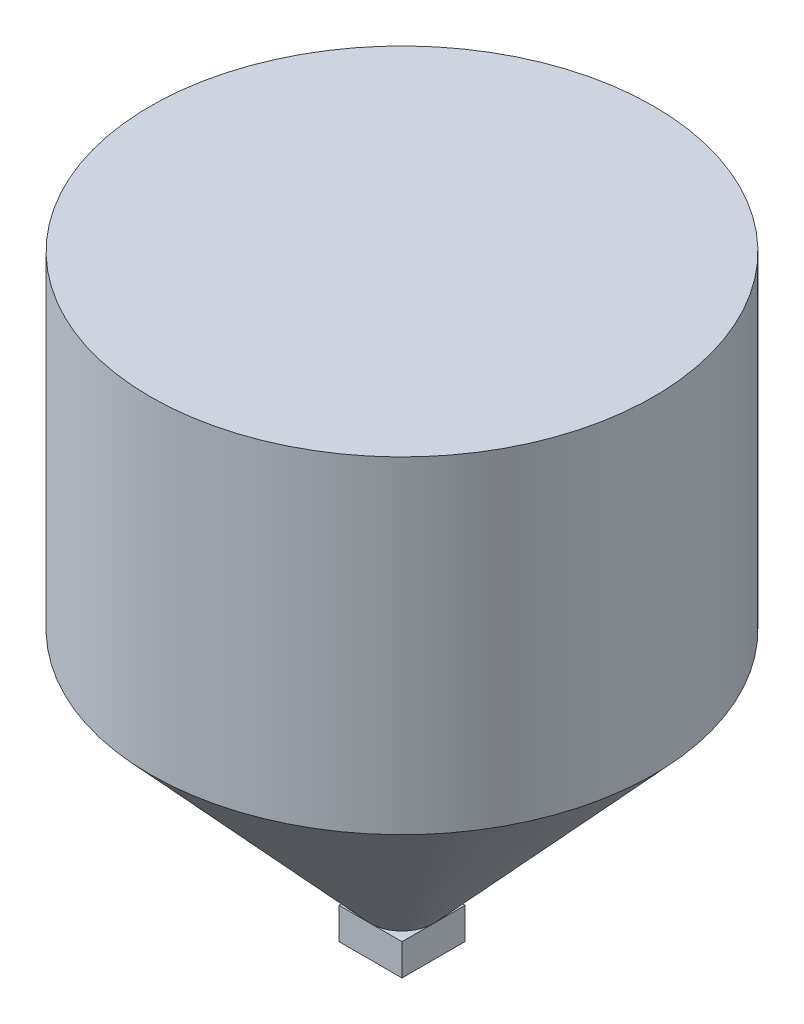
ISO-10303-21;
HEADER;
FILE_DESCRIPTION(('STEP AP214'),'2;1');
FILE_NAME('part.step','',(''),(''),'','','');
FILE_SCHEMA(('AUTOMOTIVE_DESIGN { 1 0 10303 214 1 1 1 1 }'));
ENDSEC;
DATA;
#1=APPLICATION_CONTEXT('core data for automotive mechanical design processes');
#2=APPLICATION_PROTOCOL_DEFINITION('international standard','automotive_design',2000,#1);
#3=PRODUCT_CONTEXT('',#1,'mechanical');
#4=PRODUCT('Part','Part','',(#3));
#5=PRODUCT_RELATED_PRODUCT_CATEGORY('part','',(#4));
#6=PRODUCT_DEFINITION_FORMATION('','',#4);
#7=PRODUCT_DEFINITION_CONTEXT('part definition',#1,'design');
#8=PRODUCT_DEFINITION('design','',#6,#7);
#9=PRODUCT_DEFINITION_SHAPE('','',#8);
#10=(LENGTH_UNIT() NAMED_UNIT(*) SI_UNIT(.MILLI.,.METRE.));
#11=(NAMED_UNIT(*) PLANE_ANGLE_UNIT() SI_UNIT($,.RADIAN.));
#12=(NAMED_UNIT(*) SI_UNIT($,.STERADIAN.) SOLID_ANGLE_UNIT());
#13=UNCERTAINTY_MEASURE_WITH_UNIT(LENGTH_MEASURE(1.E-05),#10,'distance_accuracy_value','');
#14=(GEOMETRIC_REPRESENTATION_CONTEXT(3) GLOBAL_UNCERTAINTY_ASSIGNED_CONTEXT((#13)) GLOBAL_UNIT_ASSIGNED_CONTEXT((#10,
#11,#12)) REPRESENTATION_CONTEXT('',''));
#15=CARTESIAN_POINT('',(0.,0.,0.));
#16=DIRECTION('',(0.,0.,1.));
#17=DIRECTION('',(1.,0.,0.));
#18=AXIS2_PLACEMENT_3D('',#15,#16,#17);
#19=CARTESIAN_POINT('',(0.,-520.,0.));
#20=DIRECTION('',(0.,1.,0.));
#21=DIRECTION('',(0.,0.,1.));
#22=AXIS2_PLACEMENT_3D('',#19,#20,#21);
#23=CYLINDRICAL_SURFACE('',#22,400.);
#24=CARTESIAN_POINT('',(0.,-520.,0.));
#25=DIRECTION('',(0.,-1.,0.));
#26=DIRECTION('',(0.,0.,-1.));
#27=AXIS2_PLACEMENT_3D('',#24,#25,#26);
#28=CIRCLE('',#27,400.);
#29=CARTESIAN_POINT('',(0.,-520.,-400.));
#30=VERTEX_POINT('',#29);
#31=EDGE_CURVE('E45',#30,#30,#28,.T.);
#32=ORIENTED_EDGE('',*,*,#31,.F.);
#33=EDGE_LOOP('',(#32));
#34=FACE_BOUND('',#33,.T.);
#35=CARTESIAN_POINT('',(0.,0.,0.));
#36=DIRECTION('',(0.,1.,0.));
#37=DIRECTION('',(0.,0.,1.));
#38=AXIS2_PLACEMENT_3D('',#35,#36,#37);
#39=CIRCLE('',#38,400.);
#40=CARTESIAN_POINT('',(0.,0.,400.));
#41=VERTEX_POINT('',#40);
#42=EDGE_CURVE('E12',#41,#41,#39,.T.);
#43=ORIENTED_EDGE('',*,*,#42,.F.);
#44=EDGE_LOOP('',(#43));
#45=FACE_BOUND('',#44,.T.);
#46=ADVANCED_FACE('F36',(#34,#45),#23,.T.);
#47=CARTESIAN_POINT('',(0.,0.,0.));
#48=DIRECTION('',(0.,1.,0.));
#49=DIRECTION('',(0.,0.,1.));
#50=AXIS2_PLACEMENT_3D('',#47,#48,#49);
#51=PLANE('',#50);
#52=ORIENTED_EDGE('',*,*,#42,.T.);
#53=EDGE_LOOP('',(#52));
#54=FACE_BOUND('',#53,.T.);
#55=ADVANCED_FACE('F218',(#54),#51,.T.);
#56=CARTESIAN_POINT('',(0.,-900.,0.));
#57=DIRECTION('',(0.,1.,0.));
#58=DIRECTION('',(0.,0.,1.));
#59=AXIS2_PLACEMENT_3D('',#56,#57,#58);
#60=CONICAL_SURFACE('',#59,50.,0.744325384806994);
#61=CARTESIAN_POINT('',(0.,-900.,0.));
#62=DIRECTION('',(0.,1.,0.));
#63=DIRECTION('',(0.,0.,1.));
#64=AXIS2_PLACEMENT_3D('',#61,#62,#63);
#65=CIRCLE('',#64,50.);
#66=CARTESIAN_POINT('',(0.,-900.,50.));
#67=VERTEX_POINT('',#66);
#68=CARTESIAN_POINT('',(50.0000000000008,-900.,0.000499690230829333));
#69=VERTEX_POINT('',#68);
#70=EDGE_CURVE('E152',#67,#69,#65,.T.);
#71=ORIENTED_EDGE('',*,*,#70,.T.);
#72=CARTESIAN_POINT('',(0.000549592109932995,-900.,-50.));
#73=VERTEX_POINT('',#72);
#74=EDGE_CURVE('E39',#69,#73,#65,.T.);
#75=ORIENTED_EDGE('',*,*,#74,.T.);
#76=CARTESIAN_POINT('',(-50.,-900.,-0.000499690230422456));
#77=VERTEX_POINT('',#76);
#78=EDGE_CURVE('E61',#73,#77,#65,.T.);
#79=ORIENTED_EDGE('',*,*,#78,.T.);
#80=EDGE_CURVE('E119',#77,#67,#65,.T.);
#81=ORIENTED_EDGE('',*,*,#80,.T.);
#82=EDGE_LOOP('',(#71,#75,#79,#81));
#83=FACE_BOUND('',#82,.T.);
#84=ORIENTED_EDGE('',*,*,#31,.T.);
#85=EDGE_LOOP('',(#84));
#86=FACE_BOUND('',#85,.T.);
#87=ADVANCED_FACE('F209',(#83,#86),#60,.T.);
#88=CARTESIAN_POINT('',(0.,-900.,0.));
#89=DIRECTION('',(0.,1.,0.));
#90=DIRECTION('',(0.,0.,1.));
#91=AXIS2_PLACEMENT_3D('',#88,#89,#90);
#92=PLANE('',#91);
#93=DIRECTION('',(-1.,0.,0.));
#94=VECTOR('',#93,1.);
#95=CARTESIAN_POINT('',(-50.,-900.,50.));
#96=LINE('',#95,#94);
#97=CARTESIAN_POINT('',(-50.,-900.,50.));
#98=VERTEX_POINT('',#97);
#99=EDGE_CURVE('E240',#67,#98,#96,.T.);
#100=ORIENTED_EDGE('',*,*,#99,.F.);
#101=ORIENTED_EDGE('',*,*,#80,.F.);
#102=DIRECTION('',(0.,0.,-1.));
#103=VECTOR('',#102,1.);
#104=CARTESIAN_POINT('',(-50.,-900.,-50.));
#105=LINE('',#104,#103);
#106=EDGE_CURVE('E129',#98,#77,#105,.T.);
#107=ORIENTED_EDGE('',*,*,#106,.F.);
#108=EDGE_LOOP('',(#100,#101,#107));
#109=FACE_BOUND('',#108,.T.);
#110=ADVANCED_FACE('F170',(#109),#92,.T.);
#111=CARTESIAN_POINT('',(-50.,-900.,-50.));
#112=VERTEX_POINT('',#111);
#113=EDGE_CURVE('E118',#77,#112,#105,.T.);
#114=ORIENTED_EDGE('',*,*,#113,.F.);
#115=ORIENTED_EDGE('',*,*,#78,.F.);
#116=DIRECTION('',(1.,0.,0.));
#117=VECTOR('',#116,1.);
#118=CARTESIAN_POINT('',(-50.,-900.,-50.));
#119=LINE('',#118,#117);
#120=EDGE_CURVE('E145',#112,#73,#119,.T.);
#121=ORIENTED_EDGE('',*,*,#120,.F.);
#122=EDGE_LOOP('',(#114,#115,#121));
#123=FACE_BOUND('',#122,.T.);
#124=ADVANCED_FACE('F238',(#123),#92,.T.);
#125=CARTESIAN_POINT('',(50.,-900.,-50.));
#126=VERTEX_POINT('',#125);
#127=EDGE_CURVE('E142',#73,#126,#119,.T.);
#128=ORIENTED_EDGE('',*,*,#127,.F.);
#129=ORIENTED_EDGE('',*,*,#74,.F.);
#130=DIRECTION('',(0.,0.,1.));
#131=VECTOR('',#130,1.);
#132=CARTESIAN_POINT('',(50.,-900.,-50.));
#133=LINE('',#132,#131);
#134=EDGE_CURVE('E53',#126,#69,#133,.T.);
#135=ORIENTED_EDGE('',*,*,#134,.F.);
#136=EDGE_LOOP('',(#128,#129,#135));
#137=FACE_BOUND('',#136,.T.);
#138=ADVANCED_FACE('F171',(#137),#92,.T.);
#139=CARTESIAN_POINT('',(-50.,-950.,-50.));
#140=DIRECTION('',(1.,0.,0.));
#141=DIRECTION('',(0.,0.,-1.));
#142=AXIS2_PLACEMENT_3D('',#139,#140,#141);
#143=PLANE('',#142);
#144=ORIENTED_EDGE('',*,*,#106,.T.);
#145=ORIENTED_EDGE('',*,*,#113,.T.);
#146=DIRECTION('',(0.,1.,0.));
#147=VECTOR('',#146,1.);
#148=CARTESIAN_POINT('',(-50.,-950.,-50.));
#149=LINE('',#148,#147);
#150=CARTESIAN_POINT('',(-50.,-950.,-50.));
#151=VERTEX_POINT('',#150);
#152=EDGE_CURVE('E100',#151,#112,#149,.T.);
#153=ORIENTED_EDGE('',*,*,#152,.F.);
#154=DIRECTION('',(0.,0.,-1.));
#155=VECTOR('',#154,1.);
#156=CARTESIAN_POINT('',(-50.,-950.,-50.));
#157=LINE('',#156,#155);
#158=CARTESIAN_POINT('',(-50.,-950.,50.));
#159=VERTEX_POINT('',#158);
#160=EDGE_CURVE('E105',#159,#151,#157,.T.);
#161=ORIENTED_EDGE('',*,*,#160,.F.);
#162=DIRECTION('',(0.,1.,0.));
#163=VECTOR('',#162,1.);
#164=CARTESIAN_POINT('',(-50.,-950.,50.));
#165=LINE('',#164,#163);
#166=EDGE_CURVE('E239',#159,#98,#165,.T.);
#167=ORIENTED_EDGE('',*,*,#166,.T.);
#168=EDGE_LOOP('',(#144,#145,#153,#161,#167));
#169=FACE_BOUND('',#168,.T.);
#170=ADVANCED_FACE('F117',(#169),#143,.F.);
#171=CARTESIAN_POINT('',(-50.,-950.,-50.));
#172=DIRECTION('',(0.,0.,1.));
#173=DIRECTION('',(1.,0.,0.));
#174=AXIS2_PLACEMENT_3D('',#171,#172,#173);
#175=PLANE('',#174);
#176=ORIENTED_EDGE('',*,*,#120,.T.);
#177=ORIENTED_EDGE('',*,*,#127,.T.);
#178=DIRECTION('',(0.,1.,0.));
#179=VECTOR('',#178,1.);
#180=CARTESIAN_POINT('',(50.,-950.,-50.));
#181=LINE('',#180,#179);
#182=CARTESIAN_POINT('',(50.,-950.,-50.));
#183=VERTEX_POINT('',#182);
#184=EDGE_CURVE('E101',#183,#126,#181,.T.);
#185=ORIENTED_EDGE('',*,*,#184,.F.);
#186=DIRECTION('',(1.,0.,0.));
#187=VECTOR('',#186,1.);
#188=CARTESIAN_POINT('',(-50.,-950.,-50.));
#189=LINE('',#188,#187);
#190=EDGE_CURVE('E95',#151,#183,#189,.T.);
#191=ORIENTED_EDGE('',*,*,#190,.F.);
#192=ORIENTED_EDGE('',*,*,#152,.T.);
#193=EDGE_LOOP('',(#176,#177,#185,#191,#192));
#194=FACE_BOUND('',#193,.T.);
#195=ADVANCED_FACE('F98',(#194),#175,.F.);
#196=CARTESIAN_POINT('',(50.,-950.,-50.));
#197=DIRECTION('',(-1.,0.,0.));
#198=DIRECTION('',(0.,0.,1.));
#199=AXIS2_PLACEMENT_3D('',#196,#197,#198);
#200=PLANE('',#199);
#201=ORIENTED_EDGE('',*,*,#134,.T.);
#202=CARTESIAN_POINT('',(50.,-900.,50.));
#203=VERTEX_POINT('',#202);
#204=EDGE_CURVE('E147',#69,#203,#133,.T.);
#205=ORIENTED_EDGE('',*,*,#204,.T.);
#206=DIRECTION('',(0.,1.,0.));
#207=VECTOR('',#206,1.);
#208=CARTESIAN_POINT('',(50.,-950.,50.));
#209=LINE('',#208,#207);
#210=CARTESIAN_POINT('',(50.,-950.,50.));
#211=VERTEX_POINT('',#210);
#212=EDGE_CURVE('E123',#211,#203,#209,.T.);
#213=ORIENTED_EDGE('',*,*,#212,.F.);
#214=DIRECTION('',(0.,0.,1.));
#215=VECTOR('',#214,1.);
#216=CARTESIAN_POINT('',(50.,-950.,-50.));
#217=LINE('',#216,#215);
#218=EDGE_CURVE('E104',#183,#211,#217,.T.);
#219=ORIENTED_EDGE('',*,*,#218,.F.);
#220=ORIENTED_EDGE('',*,*,#184,.T.);
#221=EDGE_LOOP('',(#201,#205,#213,#219,#220));
#222=FACE_BOUND('',#221,.T.);
#223=ADVANCED_FACE('F250',(#222),#200,.F.);
#224=CARTESIAN_POINT('',(-50.,-950.,50.));
#225=DIRECTION('',(0.,0.,-1.));
#226=DIRECTION('',(-1.,0.,0.));
#227=AXIS2_PLACEMENT_3D('',#224,#225,#226);
#228=PLANE('',#227);
#229=EDGE_CURVE('E114',#203,#67,#96,.T.);
#230=ORIENTED_EDGE('',*,*,#229,.T.);
#231=ORIENTED_EDGE('',*,*,#99,.T.);
#232=ORIENTED_EDGE('',*,*,#166,.F.);
#233=DIRECTION('',(-1.,0.,0.));
#234=VECTOR('',#233,1.);
#235=CARTESIAN_POINT('',(-50.,-950.,50.));
#236=LINE('',#235,#234);
#237=EDGE_CURVE('E110',#211,#159,#236,.T.);
#238=ORIENTED_EDGE('',*,*,#237,.F.);
#239=ORIENTED_EDGE('',*,*,#212,.T.);
#240=EDGE_LOOP('',(#230,#231,#232,#238,#239));
#241=FACE_BOUND('',#240,.T.);
#242=ADVANCED_FACE('F172',(#241),#228,.F.);
#243=CARTESIAN_POINT('',(0.,-950.,0.));
#244=DIRECTION('',(0.,1.,0.));
#245=DIRECTION('',(0.,0.,1.));
#246=AXIS2_PLACEMENT_3D('',#243,#244,#245);
#247=PLANE('',#246);
#248=ORIENTED_EDGE('',*,*,#160,.T.);
#249=ORIENTED_EDGE('',*,*,#190,.T.);
#250=ORIENTED_EDGE('',*,*,#218,.T.);
#251=ORIENTED_EDGE('',*,*,#237,.T.);
#252=EDGE_LOOP('',(#248,#249,#250,#251));
#253=FACE_BOUND('',#252,.T.);
#254=ADVANCED_FACE('F108',(#253),#247,.F.);
#255=ORIENTED_EDGE('',*,*,#204,.F.);
#256=ORIENTED_EDGE('',*,*,#70,.F.);
#257=ORIENTED_EDGE('',*,*,#229,.F.);
#258=EDGE_LOOP('',(#255,#256,#257));
#259=FACE_BOUND('',#258,.T.);
#260=ADVANCED_FACE('F160',(#259),#92,.T.);
#261=CLOSED_SHELL('',(#46,#55,#87,#110,#124,#138,#170,#195,#223,#242,#254,#260));
#262=MANIFOLD_SOLID_BREP('B2',#261);
#263=ADVANCED_BREP_SHAPE_REPRESENTATION('',(#18,#262),#14);
#264=SHAPE_DEFINITION_REPRESENTATION(#9,#263);
ENDSEC;
END-ISO-10303-21;
